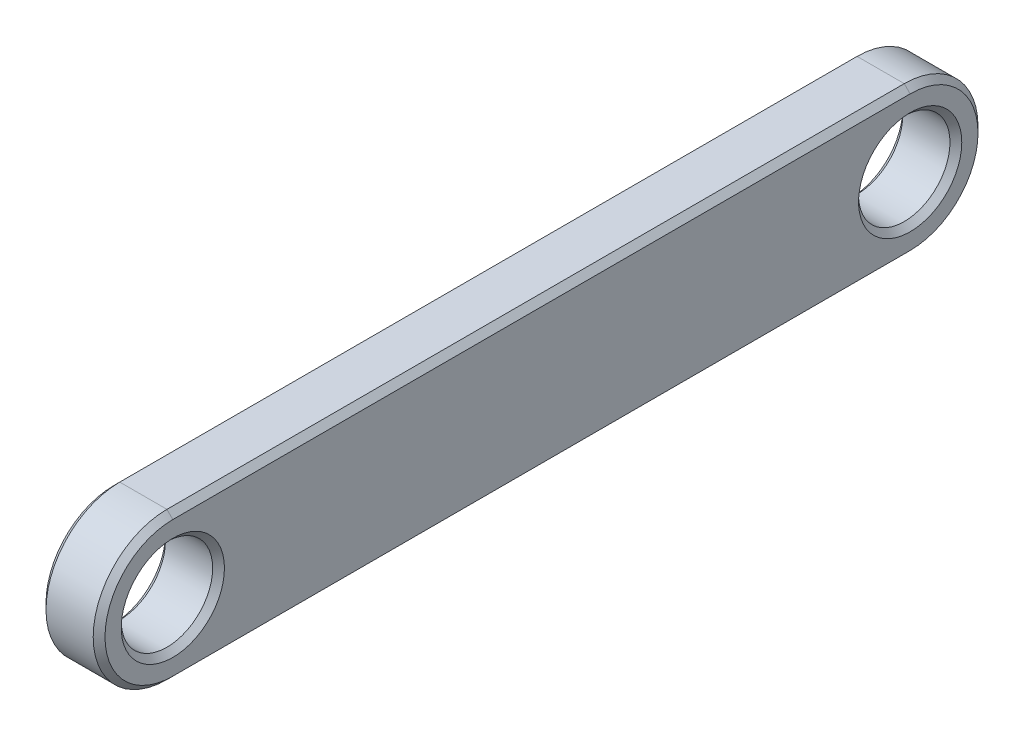
ISO-10303-21;
HEADER;
FILE_DESCRIPTION(('STEP AP214'),'2;1');
FILE_NAME('part.step','',(''),(''),'','','');
FILE_SCHEMA(('AUTOMOTIVE_DESIGN { 1 0 10303 214 1 1 1 1 }'));
ENDSEC;
DATA;
#1=APPLICATION_CONTEXT('core data for automotive mechanical design processes');
#2=APPLICATION_PROTOCOL_DEFINITION('international standard','automotive_design',2000,#1);
#3=PRODUCT_CONTEXT('',#1,'mechanical');
#4=PRODUCT('Part','Part','',(#3));
#5=PRODUCT_RELATED_PRODUCT_CATEGORY('part','',(#4));
#6=PRODUCT_DEFINITION_FORMATION('','',#4);
#7=PRODUCT_DEFINITION_CONTEXT('part definition',#1,'design');
#8=PRODUCT_DEFINITION('design','',#6,#7);
#9=PRODUCT_DEFINITION_SHAPE('','',#8);
#10=(LENGTH_UNIT() NAMED_UNIT(*) SI_UNIT(.MILLI.,.METRE.));
#11=(NAMED_UNIT(*) PLANE_ANGLE_UNIT() SI_UNIT($,.RADIAN.));
#12=(NAMED_UNIT(*) SI_UNIT($,.STERADIAN.) SOLID_ANGLE_UNIT());
#13=UNCERTAINTY_MEASURE_WITH_UNIT(LENGTH_MEASURE(1.E-05),#10,'distance_accuracy_value','');
#14=(GEOMETRIC_REPRESENTATION_CONTEXT(3) GLOBAL_UNCERTAINTY_ASSIGNED_CONTEXT((#13)) GLOBAL_UNIT_ASSIGNED_CONTEXT((#10,
#11,#12)) REPRESENTATION_CONTEXT('',''));
#15=CARTESIAN_POINT('',(0.,0.,0.));
#16=DIRECTION('',(0.,0.,1.));
#17=DIRECTION('',(1.,0.,0.));
#18=AXIS2_PLACEMENT_3D('',#15,#16,#17);
#19=CARTESIAN_POINT('',(2.,0.,12.5));
#20=DIRECTION('',(1.,0.,0.));
#21=DIRECTION('',(0.,0.,-1.));
#22=AXIS2_PLACEMENT_3D('',#19,#20,#21);
#23=PLANE('',#22);
#24=CARTESIAN_POINT('',(2.,0.,-12.5));
#25=DIRECTION('',(1.,0.,0.));
#26=DIRECTION('',(0.,0.,-1.));
#27=AXIS2_PLACEMENT_3D('',#24,#25,#26);
#28=CIRCLE('',#27,1.75);
#29=CARTESIAN_POINT('',(2.,0.,-14.25));
#30=VERTEX_POINT('',#29);
#31=EDGE_CURVE('E11',#30,#30,#28,.F.);
#32=ORIENTED_EDGE('',*,*,#31,.T.);
#33=EDGE_LOOP('',(#32));
#34=FACE_BOUND('',#33,.T.);
#35=CARTESIAN_POINT('',(2.,0.,-12.5));
#36=DIRECTION('',(1.,0.,0.));
#37=DIRECTION('',(0.,0.,-1.));
#38=AXIS2_PLACEMENT_3D('',#35,#36,#37);
#39=CIRCLE('',#38,2.30000000000002);
#40=CARTESIAN_POINT('',(2.,-2.30000000000002,-12.5));
#41=VERTEX_POINT('',#40);
#42=CARTESIAN_POINT('',(2.,2.30000000000002,-12.5));
#43=VERTEX_POINT('',#42);
#44=EDGE_CURVE('E53',#41,#43,#39,.T.);
#45=ORIENTED_EDGE('',*,*,#44,.T.);
#46=DIRECTION('',(0.,0.,1.));
#47=VECTOR('',#46,1.);
#48=CARTESIAN_POINT('',(2.,2.30000000000002,12.5));
#49=LINE('',#48,#47);
#50=CARTESIAN_POINT('',(2.,2.30000000000002,12.5));
#51=VERTEX_POINT('',#50);
#52=EDGE_CURVE('E45',#43,#51,#49,.T.);
#53=ORIENTED_EDGE('',*,*,#52,.T.);
#54=CARTESIAN_POINT('',(2.,0.,12.5));
#55=DIRECTION('',(1.,0.,0.));
#56=DIRECTION('',(0.,0.,-1.));
#57=AXIS2_PLACEMENT_3D('',#54,#55,#56);
#58=CIRCLE('',#57,2.30000000000002);
#59=CARTESIAN_POINT('',(2.,-2.30000000000001,12.5));
#60=VERTEX_POINT('',#59);
#61=EDGE_CURVE('E171',#51,#60,#58,.T.);
#62=ORIENTED_EDGE('',*,*,#61,.T.);
#63=DIRECTION('',(0.,0.,-1.));
#64=VECTOR('',#63,1.);
#65=CARTESIAN_POINT('',(2.,-2.30000000000002,-12.5));
#66=LINE('',#65,#64);
#67=EDGE_CURVE('E58',#60,#41,#66,.T.);
#68=ORIENTED_EDGE('',*,*,#67,.T.);
#69=EDGE_LOOP('',(#45,#53,#62,#68));
#70=FACE_BOUND('',#69,.T.);
#71=CARTESIAN_POINT('',(2.,0.,12.5));
#72=DIRECTION('',(1.,0.,0.));
#73=DIRECTION('',(0.,0.,-1.));
#74=AXIS2_PLACEMENT_3D('',#71,#72,#73);
#75=CIRCLE('',#74,1.75);
#76=CARTESIAN_POINT('',(2.,0.,10.75));
#77=VERTEX_POINT('',#76);
#78=EDGE_CURVE('E168',#77,#77,#75,.F.);
#79=ORIENTED_EDGE('',*,*,#78,.T.);
#80=EDGE_LOOP('',(#79));
#81=FACE_BOUND('',#80,.T.);
#82=ADVANCED_FACE('F35',(#34,#70,#81),#23,.T.);
#83=CARTESIAN_POINT('',(0.,0.,12.5));
#84=DIRECTION('',(1.,0.,0.));
#85=DIRECTION('',(0.,0.,-1.));
#86=AXIS2_PLACEMENT_3D('',#83,#84,#85);
#87=PLANE('',#86);
#88=CARTESIAN_POINT('',(0.,0.,-12.5));
#89=DIRECTION('',(1.,0.,0.));
#90=DIRECTION('',(0.,0.,-1.));
#91=AXIS2_PLACEMENT_3D('',#88,#89,#90);
#92=CIRCLE('',#91,1.74999999999999);
#93=CARTESIAN_POINT('',(0.,0.,-14.25));
#94=VERTEX_POINT('',#93);
#95=EDGE_CURVE('E133',#94,#94,#92,.T.);
#96=ORIENTED_EDGE('',*,*,#95,.T.);
#97=EDGE_LOOP('',(#96));
#98=FACE_BOUND('',#97,.T.);
#99=CARTESIAN_POINT('',(0.,0.,12.5));
#100=DIRECTION('',(1.,0.,0.));
#101=DIRECTION('',(0.,0.,-1.));
#102=AXIS2_PLACEMENT_3D('',#99,#100,#101);
#103=CIRCLE('',#102,1.75);
#104=CARTESIAN_POINT('',(0.,0.,10.75));
#105=VERTEX_POINT('',#104);
#106=EDGE_CURVE('E130',#105,#105,#103,.T.);
#107=ORIENTED_EDGE('',*,*,#106,.T.);
#108=EDGE_LOOP('',(#107));
#109=FACE_BOUND('',#108,.T.);
#110=CARTESIAN_POINT('',(0.,0.,-12.5));
#111=DIRECTION('',(1.,0.,0.));
#112=DIRECTION('',(0.,0.,-1.));
#113=AXIS2_PLACEMENT_3D('',#110,#111,#112);
#114=CIRCLE('',#113,2.3);
#115=CARTESIAN_POINT('',(0.,2.3,-12.5));
#116=VERTEX_POINT('',#115);
#117=CARTESIAN_POINT('',(0.,-2.3,-12.5));
#118=VERTEX_POINT('',#117);
#119=EDGE_CURVE('E129',#116,#118,#114,.F.);
#120=ORIENTED_EDGE('',*,*,#119,.T.);
#121=DIRECTION('',(0.,0.,1.));
#122=VECTOR('',#121,1.);
#123=CARTESIAN_POINT('',(0.,-2.3,12.5));
#124=LINE('',#123,#122);
#125=CARTESIAN_POINT('',(0.,-2.3,12.5));
#126=VERTEX_POINT('',#125);
#127=EDGE_CURVE('E108',#118,#126,#124,.T.);
#128=ORIENTED_EDGE('',*,*,#127,.T.);
#129=CARTESIAN_POINT('',(0.,0.,12.5));
#130=DIRECTION('',(1.,0.,0.));
#131=DIRECTION('',(0.,0.,-1.));
#132=AXIS2_PLACEMENT_3D('',#129,#130,#131);
#133=CIRCLE('',#132,2.3);
#134=CARTESIAN_POINT('',(0.,2.30000000000001,12.5));
#135=VERTEX_POINT('',#134);
#136=EDGE_CURVE('E118',#126,#135,#133,.F.);
#137=ORIENTED_EDGE('',*,*,#136,.T.);
#138=DIRECTION('',(0.,0.,-1.));
#139=VECTOR('',#138,1.);
#140=CARTESIAN_POINT('',(0.,2.3,12.5));
#141=LINE('',#140,#139);
#142=EDGE_CURVE('E124',#135,#116,#141,.T.);
#143=ORIENTED_EDGE('',*,*,#142,.T.);
#144=EDGE_LOOP('',(#120,#128,#137,#143));
#145=FACE_BOUND('',#144,.T.);
#146=ADVANCED_FACE('F127',(#98,#109,#145),#87,.F.);
#147=CARTESIAN_POINT('',(2.,0.,12.5));
#148=DIRECTION('',(-1.,0.,0.));
#149=DIRECTION('',(0.,0.,1.));
#150=AXIS2_PLACEMENT_3D('',#147,#148,#149);
#151=CYLINDRICAL_SURFACE('',#150,2.50000000000001);
#152=DIRECTION('',(-1.,0.,0.));
#153=VECTOR('',#152,1.);
#154=CARTESIAN_POINT('',(2.,2.50000000000001,12.5));
#155=LINE('',#154,#153);
#156=CARTESIAN_POINT('',(1.80000000000001,2.50000000000001,12.5));
#157=VERTEX_POINT('',#156);
#158=CARTESIAN_POINT('',(0.200000000000004,2.50000000000001,12.5));
#159=VERTEX_POINT('',#158);
#160=EDGE_CURVE('E180',#157,#159,#155,.T.);
#161=ORIENTED_EDGE('',*,*,#160,.T.);
#162=CARTESIAN_POINT('',(0.200000000000004,0.,12.5));
#163=DIRECTION('',(1.,0.,0.));
#164=DIRECTION('',(0.,0.,-1.));
#165=AXIS2_PLACEMENT_3D('',#162,#163,#164);
#166=CIRCLE('',#165,2.50000000000001);
#167=CARTESIAN_POINT('',(0.200000000000004,-2.50000000000001,12.5));
#168=VERTEX_POINT('',#167);
#169=EDGE_CURVE('E166',#159,#168,#166,.T.);
#170=ORIENTED_EDGE('',*,*,#169,.T.);
#171=DIRECTION('',(-1.,0.,0.));
#172=VECTOR('',#171,1.);
#173=CARTESIAN_POINT('',(2.,-2.50000000000001,12.5));
#174=LINE('',#173,#172);
#175=CARTESIAN_POINT('',(1.80000000000001,-2.50000000000001,12.5));
#176=VERTEX_POINT('',#175);
#177=EDGE_CURVE('E125',#176,#168,#174,.T.);
#178=ORIENTED_EDGE('',*,*,#177,.F.);
#179=CARTESIAN_POINT('',(1.80000000000001,0.,12.5));
#180=DIRECTION('',(1.,0.,0.));
#181=DIRECTION('',(0.,0.,-1.));
#182=AXIS2_PLACEMENT_3D('',#179,#180,#181);
#183=CIRCLE('',#182,2.50000000000001);
#184=EDGE_CURVE('E164',#176,#157,#183,.F.);
#185=ORIENTED_EDGE('',*,*,#184,.T.);
#186=EDGE_LOOP('',(#161,#170,#178,#185));
#187=FACE_BOUND('',#186,.T.);
#188=ADVANCED_FACE('F206',(#187),#151,.T.);
#189=CARTESIAN_POINT('',(2.,-2.50000000000001,12.5));
#190=DIRECTION('',(0.,1.,0.));
#191=DIRECTION('',(0.,0.,1.));
#192=AXIS2_PLACEMENT_3D('',#189,#190,#191);
#193=PLANE('',#192);
#194=ORIENTED_EDGE('',*,*,#177,.T.);
#195=DIRECTION('',(0.,0.,-1.));
#196=VECTOR('',#195,1.);
#197=CARTESIAN_POINT('',(0.200000000000004,-2.50000000000001,12.5));
#198=LINE('',#197,#196);
#199=CARTESIAN_POINT('',(0.200000000000004,-2.5,-12.5));
#200=VERTEX_POINT('',#199);
#201=EDGE_CURVE('E111',#168,#200,#198,.T.);
#202=ORIENTED_EDGE('',*,*,#201,.T.);
#203=DIRECTION('',(-1.,0.,0.));
#204=VECTOR('',#203,1.);
#205=CARTESIAN_POINT('',(2.,-2.5,-12.5));
#206=LINE('',#205,#204);
#207=CARTESIAN_POINT('',(1.80000000000001,-2.5,-12.5));
#208=VERTEX_POINT('',#207);
#209=EDGE_CURVE('E203',#208,#200,#206,.T.);
#210=ORIENTED_EDGE('',*,*,#209,.F.);
#211=DIRECTION('',(0.,0.,1.));
#212=VECTOR('',#211,1.);
#213=CARTESIAN_POINT('',(1.80000000000001,-2.50000000000001,12.5));
#214=LINE('',#213,#212);
#215=EDGE_CURVE('E152',#208,#176,#214,.T.);
#216=ORIENTED_EDGE('',*,*,#215,.T.);
#217=EDGE_LOOP('',(#194,#202,#210,#216));
#218=FACE_BOUND('',#217,.T.);
#219=ADVANCED_FACE('F201',(#218),#193,.F.);
#220=CARTESIAN_POINT('',(2.,0.,-12.5));
#221=DIRECTION('',(-1.,0.,0.));
#222=DIRECTION('',(0.,0.,1.));
#223=AXIS2_PLACEMENT_3D('',#220,#221,#222);
#224=CYLINDRICAL_SURFACE('',#223,2.50000000000001);
#225=ORIENTED_EDGE('',*,*,#209,.T.);
#226=CARTESIAN_POINT('',(0.200000000000004,0.,-12.5));
#227=DIRECTION('',(1.,0.,0.));
#228=DIRECTION('',(0.,0.,-1.));
#229=AXIS2_PLACEMENT_3D('',#226,#227,#228);
#230=CIRCLE('',#229,2.50000000000001);
#231=CARTESIAN_POINT('',(0.200000000000004,2.50000000000001,-12.5));
#232=VERTEX_POINT('',#231);
#233=EDGE_CURVE('E157',#200,#232,#230,.T.);
#234=ORIENTED_EDGE('',*,*,#233,.T.);
#235=DIRECTION('',(-1.,0.,0.));
#236=VECTOR('',#235,1.);
#237=CARTESIAN_POINT('',(2.,2.50000000000001,-12.5));
#238=LINE('',#237,#236);
#239=CARTESIAN_POINT('',(1.80000000000001,2.50000000000001,-12.5));
#240=VERTEX_POINT('',#239);
#241=EDGE_CURVE('E209',#240,#232,#238,.T.);
#242=ORIENTED_EDGE('',*,*,#241,.F.);
#243=CARTESIAN_POINT('',(1.80000000000001,0.,-12.5));
#244=DIRECTION('',(1.,0.,0.));
#245=DIRECTION('',(0.,0.,-1.));
#246=AXIS2_PLACEMENT_3D('',#243,#244,#245);
#247=CIRCLE('',#246,2.50000000000001);
#248=EDGE_CURVE('E155',#240,#208,#247,.F.);
#249=ORIENTED_EDGE('',*,*,#248,.T.);
#250=EDGE_LOOP('',(#225,#234,#242,#249));
#251=FACE_BOUND('',#250,.T.);
#252=ADVANCED_FACE('F222',(#251),#224,.T.);
#253=CARTESIAN_POINT('',(2.,2.50000000000001,12.5));
#254=DIRECTION('',(0.,-1.,0.));
#255=DIRECTION('',(0.,0.,-1.));
#256=AXIS2_PLACEMENT_3D('',#253,#254,#255);
#257=PLANE('',#256);
#258=ORIENTED_EDGE('',*,*,#241,.T.);
#259=DIRECTION('',(0.,0.,1.));
#260=VECTOR('',#259,1.);
#261=CARTESIAN_POINT('',(0.200000000000004,2.50000000000001,12.5));
#262=LINE('',#261,#260);
#263=EDGE_CURVE('E162',#232,#159,#262,.T.);
#264=ORIENTED_EDGE('',*,*,#263,.T.);
#265=ORIENTED_EDGE('',*,*,#160,.F.);
#266=DIRECTION('',(0.,0.,-1.));
#267=VECTOR('',#266,1.);
#268=CARTESIAN_POINT('',(1.80000000000001,2.50000000000001,-12.5));
#269=LINE('',#268,#267);
#270=EDGE_CURVE('E159',#157,#240,#269,.T.);
#271=ORIENTED_EDGE('',*,*,#270,.T.);
#272=EDGE_LOOP('',(#258,#264,#265,#271));
#273=FACE_BOUND('',#272,.T.);
#274=ADVANCED_FACE('F226',(#273),#257,.F.);
#275=CARTESIAN_POINT('',(2.,0.,12.5));
#276=DIRECTION('',(-1.,0.,0.));
#277=DIRECTION('',(0.,0.,1.));
#278=AXIS2_PLACEMENT_3D('',#275,#276,#277);
#279=CYLINDRICAL_SURFACE('',#278,1.55);
#280=CARTESIAN_POINT('',(0.200000000000001,0.,12.5));
#281=DIRECTION('',(1.,0.,0.));
#282=DIRECTION('',(0.,0.,-1.));
#283=AXIS2_PLACEMENT_3D('',#280,#281,#282);
#284=CIRCLE('',#283,1.55);
#285=CARTESIAN_POINT('',(0.200000000000001,0.,10.95));
#286=VERTEX_POINT('',#285);
#287=EDGE_CURVE('E149',#286,#286,#284,.F.);
#288=ORIENTED_EDGE('',*,*,#287,.T.);
#289=EDGE_LOOP('',(#288));
#290=FACE_BOUND('',#289,.T.);
#291=CARTESIAN_POINT('',(1.8,0.,12.5));
#292=DIRECTION('',(1.,0.,0.));
#293=DIRECTION('',(0.,0.,-1.));
#294=AXIS2_PLACEMENT_3D('',#291,#292,#293);
#295=CIRCLE('',#294,1.55);
#296=CARTESIAN_POINT('',(1.8,0.,10.95));
#297=VERTEX_POINT('',#296);
#298=EDGE_CURVE('E146',#297,#297,#295,.T.);
#299=ORIENTED_EDGE('',*,*,#298,.T.);
#300=EDGE_LOOP('',(#299));
#301=FACE_BOUND('',#300,.T.);
#302=ADVANCED_FACE('F242',(#290,#301),#279,.F.);
#303=CARTESIAN_POINT('',(2.,0.,-12.5));
#304=DIRECTION('',(-1.,0.,0.));
#305=DIRECTION('',(0.,0.,1.));
#306=AXIS2_PLACEMENT_3D('',#303,#304,#305);
#307=CYLINDRICAL_SURFACE('',#306,1.55);
#308=CARTESIAN_POINT('',(0.19999999999999,0.,-12.5));
#309=DIRECTION('',(1.,0.,0.));
#310=DIRECTION('',(0.,0.,-1.));
#311=AXIS2_PLACEMENT_3D('',#308,#309,#310);
#312=CIRCLE('',#311,1.55);
#313=CARTESIAN_POINT('',(0.19999999999999,0.,-14.05));
#314=VERTEX_POINT('',#313);
#315=EDGE_CURVE('E143',#314,#314,#312,.F.);
#316=ORIENTED_EDGE('',*,*,#315,.T.);
#317=EDGE_LOOP('',(#316));
#318=FACE_BOUND('',#317,.T.);
#319=CARTESIAN_POINT('',(1.8,0.,-12.5));
#320=DIRECTION('',(1.,0.,0.));
#321=DIRECTION('',(0.,0.,-1.));
#322=AXIS2_PLACEMENT_3D('',#319,#320,#321);
#323=CIRCLE('',#322,1.55);
#324=CARTESIAN_POINT('',(1.8,0.,-14.05));
#325=VERTEX_POINT('',#324);
#326=EDGE_CURVE('E140',#325,#325,#323,.T.);
#327=ORIENTED_EDGE('',*,*,#326,.T.);
#328=EDGE_LOOP('',(#327));
#329=FACE_BOUND('',#328,.T.);
#330=ADVANCED_FACE('F244',(#318,#329),#307,.F.);
#331=CARTESIAN_POINT('',(0.,0.,-12.5));
#332=DIRECTION('',(-1.,0.,0.));
#333=DIRECTION('',(0.,0.,1.));
#334=AXIS2_PLACEMENT_3D('',#331,#332,#333);
#335=CONICAL_SURFACE('',#334,1.74999999999999,0.785398163397452);
#336=ORIENTED_EDGE('',*,*,#315,.F.);
#337=EDGE_LOOP('',(#336));
#338=FACE_BOUND('',#337,.T.);
#339=ORIENTED_EDGE('',*,*,#95,.F.);
#340=EDGE_LOOP('',(#339));
#341=FACE_BOUND('',#340,.T.);
#342=ADVANCED_FACE('F251',(#338,#341),#335,.F.);
#343=CARTESIAN_POINT('',(0.,0.,12.5));
#344=DIRECTION('',(-1.,0.,0.));
#345=DIRECTION('',(0.,0.,1.));
#346=AXIS2_PLACEMENT_3D('',#343,#344,#345);
#347=CONICAL_SURFACE('',#346,1.75,0.785398163397452);
#348=ORIENTED_EDGE('',*,*,#287,.F.);
#349=EDGE_LOOP('',(#348));
#350=FACE_BOUND('',#349,.T.);
#351=ORIENTED_EDGE('',*,*,#106,.F.);
#352=EDGE_LOOP('',(#351));
#353=FACE_BOUND('',#352,.T.);
#354=ADVANCED_FACE('F271',(#350,#353),#347,.F.);
#355=CARTESIAN_POINT('',(0.200000000000004,2.50000000000001,12.5));
#356=DIRECTION('',(0.707106781186551,-0.707106781186544,0.));
#357=DIRECTION('',(0.,0.,1.));
#358=AXIS2_PLACEMENT_3D('',#355,#356,#357);
#359=PLANE('',#358);
#360=DIRECTION('',(0.707106781186544,0.707106781186551,0.));
#361=VECTOR('',#360,1.);
#362=CARTESIAN_POINT('',(0.,2.3,-12.5));
#363=LINE('',#362,#361);
#364=EDGE_CURVE('E114',#116,#232,#363,.T.);
#365=ORIENTED_EDGE('',*,*,#364,.F.);
#366=ORIENTED_EDGE('',*,*,#142,.F.);
#367=DIRECTION('',(-0.707106781186544,-0.707106781186551,0.));
#368=VECTOR('',#367,1.);
#369=CARTESIAN_POINT('',(0.200000000000004,2.50000000000001,12.5));
#370=LINE('',#369,#368);
#371=EDGE_CURVE('E121',#159,#135,#370,.T.);
#372=ORIENTED_EDGE('',*,*,#371,.F.);
#373=ORIENTED_EDGE('',*,*,#263,.F.);
#374=EDGE_LOOP('',(#365,#366,#372,#373));
#375=FACE_BOUND('',#374,.T.);
#376=ADVANCED_FACE('F215',(#375),#359,.F.);
#377=CARTESIAN_POINT('',(0.200000000000004,0.,12.5));
#378=DIRECTION('',(1.,0.,0.));
#379=DIRECTION('',(0.,0.,-1.));
#380=AXIS2_PLACEMENT_3D('',#377,#378,#379);
#381=CONICAL_SURFACE('',#380,2.50000000000001,0.785398163397454);
#382=ORIENTED_EDGE('',*,*,#371,.T.);
#383=ORIENTED_EDGE('',*,*,#136,.F.);
#384=DIRECTION('',(-0.707106781186544,0.707106781186551,0.));
#385=VECTOR('',#384,1.);
#386=CARTESIAN_POINT('',(0.200000000000004,-2.5,12.5));
#387=LINE('',#386,#385);
#388=EDGE_CURVE('E104',#168,#126,#387,.T.);
#389=ORIENTED_EDGE('',*,*,#388,.F.);
#390=ORIENTED_EDGE('',*,*,#169,.F.);
#391=EDGE_LOOP('',(#382,#383,#389,#390));
#392=FACE_BOUND('',#391,.T.);
#393=ADVANCED_FACE('F119',(#392),#381,.T.);
#394=CARTESIAN_POINT('',(0.200000000000004,0.,-12.5));
#395=DIRECTION('',(1.,0.,0.));
#396=DIRECTION('',(0.,0.,-1.));
#397=AXIS2_PLACEMENT_3D('',#394,#395,#396);
#398=CONICAL_SURFACE('',#397,2.50000000000001,0.785398163397454);
#399=ORIENTED_EDGE('',*,*,#364,.T.);
#400=ORIENTED_EDGE('',*,*,#233,.F.);
#401=DIRECTION('',(0.707106781186544,-0.707106781186551,0.));
#402=VECTOR('',#401,1.);
#403=CARTESIAN_POINT('',(0.,-2.3,-12.5));
#404=LINE('',#403,#402);
#405=EDGE_CURVE('E115',#118,#200,#404,.T.);
#406=ORIENTED_EDGE('',*,*,#405,.F.);
#407=ORIENTED_EDGE('',*,*,#119,.F.);
#408=EDGE_LOOP('',(#399,#400,#406,#407));
#409=FACE_BOUND('',#408,.T.);
#410=ADVANCED_FACE('F218',(#409),#398,.T.);
#411=CARTESIAN_POINT('',(0.200000000000004,-2.50000000000001,12.5));
#412=DIRECTION('',(0.707106781186551,0.707106781186544,0.));
#413=DIRECTION('',(0.,0.,-1.));
#414=AXIS2_PLACEMENT_3D('',#411,#412,#413);
#415=PLANE('',#414);
#416=ORIENTED_EDGE('',*,*,#388,.T.);
#417=ORIENTED_EDGE('',*,*,#127,.F.);
#418=ORIENTED_EDGE('',*,*,#405,.T.);
#419=ORIENTED_EDGE('',*,*,#201,.F.);
#420=EDGE_LOOP('',(#416,#417,#418,#419));
#421=FACE_BOUND('',#420,.T.);
#422=ADVANCED_FACE('F106',(#421),#415,.F.);
#423=CARTESIAN_POINT('',(1.8,0.,-12.5));
#424=DIRECTION('',(1.,0.,0.));
#425=DIRECTION('',(0.,0.,-1.));
#426=AXIS2_PLACEMENT_3D('',#423,#424,#425);
#427=CONICAL_SURFACE('',#426,1.55,0.785398163397454);
#428=ORIENTED_EDGE('',*,*,#31,.F.);
#429=EDGE_LOOP('',(#428));
#430=FACE_BOUND('',#429,.T.);
#431=ORIENTED_EDGE('',*,*,#326,.F.);
#432=EDGE_LOOP('',(#431));
#433=FACE_BOUND('',#432,.T.);
#434=ADVANCED_FACE('F286',(#430,#433),#427,.F.);
#435=CARTESIAN_POINT('',(2.,-2.30000000000002,12.5));
#436=DIRECTION('',(0.707106781186551,-0.707106781186544,0.));
#437=DIRECTION('',(0.,0.,1.));
#438=AXIS2_PLACEMENT_3D('',#435,#436,#437);
#439=PLANE('',#438);
#440=DIRECTION('',(0.707106781186544,0.707106781186551,0.));
#441=VECTOR('',#440,1.);
#442=CARTESIAN_POINT('',(1.80000000000001,-2.50000000000001,12.5));
#443=LINE('',#442,#441);
#444=EDGE_CURVE('E184',#176,#60,#443,.T.);
#445=ORIENTED_EDGE('',*,*,#444,.F.);
#446=ORIENTED_EDGE('',*,*,#215,.F.);
#447=DIRECTION('',(-0.707106781186544,-0.707106781186551,0.));
#448=VECTOR('',#447,1.);
#449=CARTESIAN_POINT('',(2.,-2.30000000000002,-12.5));
#450=LINE('',#449,#448);
#451=EDGE_CURVE('E40',#41,#208,#450,.T.);
#452=ORIENTED_EDGE('',*,*,#451,.F.);
#453=ORIENTED_EDGE('',*,*,#67,.F.);
#454=EDGE_LOOP('',(#445,#446,#452,#453));
#455=FACE_BOUND('',#454,.T.);
#456=ADVANCED_FACE('F196',(#455),#439,.T.);
#457=CARTESIAN_POINT('',(2.,0.,-12.5));
#458=DIRECTION('',(-1.,0.,0.));
#459=DIRECTION('',(0.,0.,1.));
#460=AXIS2_PLACEMENT_3D('',#457,#458,#459);
#461=CONICAL_SURFACE('',#460,2.30000000000002,0.785398163397454);
#462=ORIENTED_EDGE('',*,*,#451,.T.);
#463=ORIENTED_EDGE('',*,*,#248,.F.);
#464=DIRECTION('',(-0.707106781186544,0.707106781186551,0.));
#465=VECTOR('',#464,1.);
#466=CARTESIAN_POINT('',(2.,2.30000000000002,-12.5));
#467=LINE('',#466,#465);
#468=EDGE_CURVE('E183',#43,#240,#467,.T.);
#469=ORIENTED_EDGE('',*,*,#468,.F.);
#470=ORIENTED_EDGE('',*,*,#44,.F.);
#471=EDGE_LOOP('',(#462,#463,#469,#470));
#472=FACE_BOUND('',#471,.T.);
#473=ADVANCED_FACE('F193',(#472),#461,.T.);
#474=CARTESIAN_POINT('',(2.,0.,12.5));
#475=DIRECTION('',(-1.,0.,0.));
#476=DIRECTION('',(0.,0.,1.));
#477=AXIS2_PLACEMENT_3D('',#474,#475,#476);
#478=CONICAL_SURFACE('',#477,2.30000000000002,0.785398163397454);
#479=ORIENTED_EDGE('',*,*,#444,.T.);
#480=ORIENTED_EDGE('',*,*,#61,.F.);
#481=DIRECTION('',(0.707106781186544,-0.707106781186551,0.));
#482=VECTOR('',#481,1.);
#483=CARTESIAN_POINT('',(1.80000000000001,2.50000000000001,12.5));
#484=LINE('',#483,#482);
#485=EDGE_CURVE('E181',#157,#51,#484,.T.);
#486=ORIENTED_EDGE('',*,*,#485,.F.);
#487=ORIENTED_EDGE('',*,*,#184,.F.);
#488=EDGE_LOOP('',(#479,#480,#486,#487));
#489=FACE_BOUND('',#488,.T.);
#490=ADVANCED_FACE('F231',(#489),#478,.T.);
#491=CARTESIAN_POINT('',(2.,2.30000000000002,12.5));
#492=DIRECTION('',(0.707106781186551,0.707106781186544,0.));
#493=DIRECTION('',(0.,0.,-1.));
#494=AXIS2_PLACEMENT_3D('',#491,#492,#493);
#495=PLANE('',#494);
#496=ORIENTED_EDGE('',*,*,#468,.T.);
#497=ORIENTED_EDGE('',*,*,#270,.F.);
#498=ORIENTED_EDGE('',*,*,#485,.T.);
#499=ORIENTED_EDGE('',*,*,#52,.F.);
#500=EDGE_LOOP('',(#496,#497,#498,#499));
#501=FACE_BOUND('',#500,.T.);
#502=ADVANCED_FACE('F229',(#501),#495,.T.);
#503=CARTESIAN_POINT('',(1.8,0.,12.5));
#504=DIRECTION('',(1.,0.,0.));
#505=DIRECTION('',(0.,0.,-1.));
#506=AXIS2_PLACEMENT_3D('',#503,#504,#505);
#507=CONICAL_SURFACE('',#506,1.55,0.785398163397454);
#508=ORIENTED_EDGE('',*,*,#78,.F.);
#509=EDGE_LOOP('',(#508));
#510=FACE_BOUND('',#509,.T.);
#511=ORIENTED_EDGE('',*,*,#298,.F.);
#512=EDGE_LOOP('',(#511));
#513=FACE_BOUND('',#512,.T.);
#514=ADVANCED_FACE('F38',(#510,#513),#507,.F.);
#515=CLOSED_SHELL('',(#82,#146,#188,#219,#252,#274,#302,#330,#342,#354,#376,#393,#410,#422,#434,
#456,#473,#490,#502,#514));
#516=MANIFOLD_SOLID_BREP('B2',#515);
#517=ADVANCED_BREP_SHAPE_REPRESENTATION('',(#18,#516),#14);
#518=SHAPE_DEFINITION_REPRESENTATION(#9,#517);
ENDSEC;
END-ISO-10303-21;
